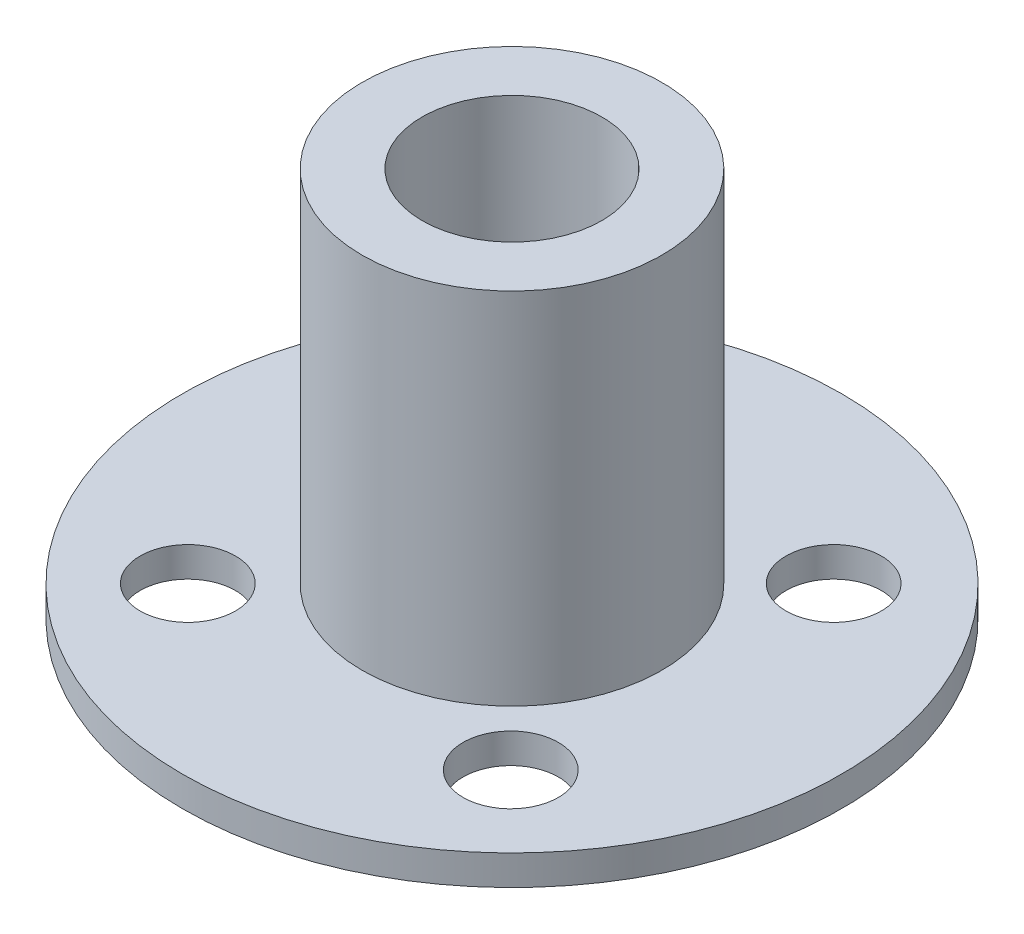
ISO-10303-21;
HEADER;
FILE_DESCRIPTION(('STEP AP214'),'2;1');
FILE_NAME('part.step','',(''),(''),'','','');
FILE_SCHEMA(('AUTOMOTIVE_DESIGN { 1 0 10303 214 1 1 1 1 }'));
ENDSEC;
DATA;
#1=APPLICATION_CONTEXT('core data for automotive mechanical design processes');
#2=APPLICATION_PROTOCOL_DEFINITION('international standard','automotive_design',2000,#1);
#3=PRODUCT_CONTEXT('',#1,'mechanical');
#4=PRODUCT('Part','Part','',(#3));
#5=PRODUCT_RELATED_PRODUCT_CATEGORY('part','',(#4));
#6=PRODUCT_DEFINITION_FORMATION('','',#4);
#7=PRODUCT_DEFINITION_CONTEXT('part definition',#1,'design');
#8=PRODUCT_DEFINITION('design','',#6,#7);
#9=PRODUCT_DEFINITION_SHAPE('','',#8);
#10=(LENGTH_UNIT() NAMED_UNIT(*) SI_UNIT(.MILLI.,.METRE.));
#11=(NAMED_UNIT(*) PLANE_ANGLE_UNIT() SI_UNIT($,.RADIAN.));
#12=(NAMED_UNIT(*) SI_UNIT($,.STERADIAN.) SOLID_ANGLE_UNIT());
#13=UNCERTAINTY_MEASURE_WITH_UNIT(LENGTH_MEASURE(1.E-05),#10,'distance_accuracy_value','');
#14=(GEOMETRIC_REPRESENTATION_CONTEXT(3) GLOBAL_UNCERTAINTY_ASSIGNED_CONTEXT((#13)) GLOBAL_UNIT_ASSIGNED_CONTEXT((#10,
#11,#12)) REPRESENTATION_CONTEXT('',''));
#15=CARTESIAN_POINT('',(0.,0.,0.));
#16=DIRECTION('',(0.,0.,1.));
#17=DIRECTION('',(1.,0.,0.));
#18=AXIS2_PLACEMENT_3D('',#15,#16,#17);
#19=CARTESIAN_POINT('',(0.,1.,0.));
#20=DIRECTION('',(0.,-1.,0.));
#21=DIRECTION('',(0.,0.,-1.));
#22=AXIS2_PLACEMENT_3D('',#19,#20,#21);
#23=CYLINDRICAL_SURFACE('',#22,11.);
#24=CARTESIAN_POINT('',(0.,1.,0.));
#25=DIRECTION('',(0.,1.,0.));
#26=DIRECTION('',(0.,0.,1.));
#27=AXIS2_PLACEMENT_3D('',#24,#25,#26);
#28=CIRCLE('',#27,11.);
#29=CARTESIAN_POINT('',(0.,1.,11.));
#30=VERTEX_POINT('',#29);
#31=EDGE_CURVE('E42',#30,#30,#28,.T.);
#32=ORIENTED_EDGE('',*,*,#31,.F.);
#33=EDGE_LOOP('',(#32));
#34=FACE_BOUND('',#33,.T.);
#35=CARTESIAN_POINT('',(0.,0.,0.));
#36=DIRECTION('',(0.,1.,0.));
#37=DIRECTION('',(0.,0.,1.));
#38=AXIS2_PLACEMENT_3D('',#35,#36,#37);
#39=CIRCLE('',#38,11.);
#40=CARTESIAN_POINT('',(0.,0.,11.));
#41=VERTEX_POINT('',#40);
#42=EDGE_CURVE('E38',#41,#41,#39,.T.);
#43=ORIENTED_EDGE('',*,*,#42,.T.);
#44=EDGE_LOOP('',(#43));
#45=FACE_BOUND('',#44,.T.);
#46=ADVANCED_FACE('F35',(#34,#45),#23,.T.);
#47=CARTESIAN_POINT('',(0.,1.,0.));
#48=DIRECTION('',(0.,1.,0.));
#49=DIRECTION('',(0.,0.,1.));
#50=AXIS2_PLACEMENT_3D('',#47,#48,#49);
#51=PLANE('',#50);
#52=CARTESIAN_POINT('',(5.35568955201766,1.,5.39783003838213));
#53=DIRECTION('',(0.,1.,0.));
#54=DIRECTION('',(0.,0.,1.));
#55=AXIS2_PLACEMENT_3D('',#52,#53,#54);
#56=CIRCLE('',#55,1.59115676356032);
#57=CARTESIAN_POINT('',(5.35568955201766,1.,6.98898680194246));
#58=VERTEX_POINT('',#57);
#59=EDGE_CURVE('E64',#58,#58,#56,.T.);
#60=ORIENTED_EDGE('',*,*,#59,.F.);
#61=EDGE_LOOP('',(#60));
#62=FACE_BOUND('',#61,.T.);
#63=CARTESIAN_POINT('',(-5.42311433016518,1.,5.39783003838213));
#64=DIRECTION('',(0.,1.,0.));
#65=DIRECTION('',(0.,0.,1.));
#66=AXIS2_PLACEMENT_3D('',#63,#64,#65);
#67=CIRCLE('',#66,1.59115676356032);
#68=CARTESIAN_POINT('',(-5.42311433016518,1.,6.98898680194245));
#69=VERTEX_POINT('',#68);
#70=EDGE_CURVE('E71',#69,#69,#67,.T.);
#71=ORIENTED_EDGE('',*,*,#70,.F.);
#72=EDGE_LOOP('',(#71));
#73=FACE_BOUND('',#72,.T.);
#74=CARTESIAN_POINT('',(-5.42311433018579,1.,-5.38097384381433));
#75=DIRECTION('',(0.,1.,0.));
#76=DIRECTION('',(0.,0.,1.));
#77=AXIS2_PLACEMENT_3D('',#74,#75,#76);
#78=CIRCLE('',#77,1.59115676358094);
#79=CARTESIAN_POINT('',(-5.42311433018579,1.,-3.78981708023339));
#80=VERTEX_POINT('',#79);
#81=EDGE_CURVE('E63',#80,#80,#78,.T.);
#82=ORIENTED_EDGE('',*,*,#81,.F.);
#83=EDGE_LOOP('',(#82));
#84=FACE_BOUND('',#83,.T.);
#85=CARTESIAN_POINT('',(5.35568955201766,1.,-5.3809738438007));
#86=DIRECTION('',(0.,1.,0.));
#87=DIRECTION('',(0.,0.,1.));
#88=AXIS2_PLACEMENT_3D('',#85,#86,#87);
#89=CIRCLE('',#88,1.59115676356033);
#90=CARTESIAN_POINT('',(5.35568955201766,1.,-3.78981708024038));
#91=VERTEX_POINT('',#90);
#92=EDGE_CURVE('E60',#91,#91,#89,.T.);
#93=ORIENTED_EDGE('',*,*,#92,.F.);
#94=EDGE_LOOP('',(#93));
#95=FACE_BOUND('',#94,.T.);
#96=CARTESIAN_POINT('',(0.,1.,0.));
#97=DIRECTION('',(0.,1.,0.));
#98=DIRECTION('',(0.,0.,1.));
#99=AXIS2_PLACEMENT_3D('',#96,#97,#98);
#100=CIRCLE('',#99,5.);
#101=CARTESIAN_POINT('',(0.,1.,5.));
#102=VERTEX_POINT('',#101);
#103=EDGE_CURVE('E10',#102,#102,#100,.T.);
#104=ORIENTED_EDGE('',*,*,#103,.F.);
#105=EDGE_LOOP('',(#104));
#106=FACE_BOUND('',#105,.T.);
#107=ORIENTED_EDGE('',*,*,#31,.T.);
#108=EDGE_LOOP('',(#107));
#109=FACE_BOUND('',#108,.T.);
#110=ADVANCED_FACE('F88',(#62,#73,#84,#95,#106,#109),#51,.T.);
#111=CARTESIAN_POINT('',(0.,0.,0.));
#112=DIRECTION('',(0.,1.,0.));
#113=DIRECTION('',(0.,0.,1.));
#114=AXIS2_PLACEMENT_3D('',#111,#112,#113);
#115=PLANE('',#114);
#116=CARTESIAN_POINT('',(5.35568955201766,0.,5.39783003838213));
#117=DIRECTION('',(0.,1.,0.));
#118=DIRECTION('',(0.,0.,1.));
#119=AXIS2_PLACEMENT_3D('',#116,#117,#118);
#120=CIRCLE('',#119,1.59115676356032);
#121=CARTESIAN_POINT('',(5.35568955201766,0.,6.98898680194246));
#122=VERTEX_POINT('',#121);
#123=EDGE_CURVE('E68',#122,#122,#120,.F.);
#124=ORIENTED_EDGE('',*,*,#123,.F.);
#125=EDGE_LOOP('',(#124));
#126=FACE_BOUND('',#125,.T.);
#127=CARTESIAN_POINT('',(-5.42311433016518,0.,5.39783003838213));
#128=DIRECTION('',(0.,1.,0.));
#129=DIRECTION('',(0.,0.,1.));
#130=AXIS2_PLACEMENT_3D('',#127,#128,#129);
#131=CIRCLE('',#130,1.59115676356032);
#132=CARTESIAN_POINT('',(-5.42311433016518,0.,6.98898680194245));
#133=VERTEX_POINT('',#132);
#134=EDGE_CURVE('E67',#133,#133,#131,.F.);
#135=ORIENTED_EDGE('',*,*,#134,.F.);
#136=EDGE_LOOP('',(#135));
#137=FACE_BOUND('',#136,.T.);
#138=CARTESIAN_POINT('',(-5.42311433018579,0.,-5.38097384381433));
#139=DIRECTION('',(0.,1.,0.));
#140=DIRECTION('',(0.,0.,1.));
#141=AXIS2_PLACEMENT_3D('',#138,#139,#140);
#142=CIRCLE('',#141,1.59115676358094);
#143=CARTESIAN_POINT('',(-5.42311433018579,0.,-3.78981708023339));
#144=VERTEX_POINT('',#143);
#145=EDGE_CURVE('E74',#144,#144,#142,.F.);
#146=ORIENTED_EDGE('',*,*,#145,.F.);
#147=EDGE_LOOP('',(#146));
#148=FACE_BOUND('',#147,.T.);
#149=CARTESIAN_POINT('',(5.35568955201766,0.,-5.3809738438007));
#150=DIRECTION('',(0.,1.,0.));
#151=DIRECTION('',(0.,0.,1.));
#152=AXIS2_PLACEMENT_3D('',#149,#150,#151);
#153=CIRCLE('',#152,1.59115676356033);
#154=CARTESIAN_POINT('',(5.35568955201766,0.,-3.78981708024038));
#155=VERTEX_POINT('',#154);
#156=EDGE_CURVE('E55',#155,#155,#153,.F.);
#157=ORIENTED_EDGE('',*,*,#156,.F.);
#158=EDGE_LOOP('',(#157));
#159=FACE_BOUND('',#158,.T.);
#160=ORIENTED_EDGE('',*,*,#42,.F.);
#161=EDGE_LOOP('',(#160));
#162=FACE_BOUND('',#161,.T.);
#163=ADVANCED_FACE('F84',(#126,#137,#148,#159,#162),#115,.F.);
#164=CARTESIAN_POINT('',(0.,13.,0.));
#165=DIRECTION('',(0.,-1.,0.));
#166=DIRECTION('',(0.,0.,-1.));
#167=AXIS2_PLACEMENT_3D('',#164,#165,#166);
#168=CYLINDRICAL_SURFACE('',#167,5.);
#169=CARTESIAN_POINT('',(0.,13.,0.));
#170=DIRECTION('',(0.,1.,0.));
#171=DIRECTION('',(0.,0.,1.));
#172=AXIS2_PLACEMENT_3D('',#169,#170,#171);
#173=CIRCLE('',#172,5.);
#174=CARTESIAN_POINT('',(0.,13.,5.));
#175=VERTEX_POINT('',#174);
#176=EDGE_CURVE('E48',#175,#175,#173,.T.);
#177=ORIENTED_EDGE('',*,*,#176,.F.);
#178=EDGE_LOOP('',(#177));
#179=FACE_BOUND('',#178,.T.);
#180=ORIENTED_EDGE('',*,*,#103,.T.);
#181=EDGE_LOOP('',(#180));
#182=FACE_BOUND('',#181,.T.);
#183=ADVANCED_FACE('F87',(#179,#182),#168,.T.);
#184=CARTESIAN_POINT('',(0.,13.,0.));
#185=DIRECTION('',(0.,1.,0.));
#186=DIRECTION('',(0.,0.,1.));
#187=AXIS2_PLACEMENT_3D('',#184,#185,#186);
#188=PLANE('',#187);
#189=CARTESIAN_POINT('',(0.,13.,0.));
#190=DIRECTION('',(0.,1.,0.));
#191=DIRECTION('',(0.,0.,1.));
#192=AXIS2_PLACEMENT_3D('',#189,#190,#191);
#193=CIRCLE('',#192,3.);
#194=CARTESIAN_POINT('',(0.,13.,3.));
#195=VERTEX_POINT('',#194);
#196=EDGE_CURVE('E52',#195,#195,#193,.T.);
#197=ORIENTED_EDGE('',*,*,#196,.F.);
#198=EDGE_LOOP('',(#197));
#199=FACE_BOUND('',#198,.T.);
#200=ORIENTED_EDGE('',*,*,#176,.T.);
#201=EDGE_LOOP('',(#200));
#202=FACE_BOUND('',#201,.T.);
#203=ADVANCED_FACE('F111',(#199,#202),#188,.T.);
#204=CARTESIAN_POINT('',(0.,1.,0.));
#205=DIRECTION('',(0.,1.,0.));
#206=DIRECTION('',(0.,0.,1.));
#207=AXIS2_PLACEMENT_3D('',#204,#205,#206);
#208=CYLINDRICAL_SURFACE('',#207,3.);
#209=CARTESIAN_POINT('',(0.,1.,0.));
#210=DIRECTION('',(0.,1.,0.));
#211=DIRECTION('',(0.,0.,1.));
#212=AXIS2_PLACEMENT_3D('',#209,#210,#211);
#213=CIRCLE('',#212,3.);
#214=CARTESIAN_POINT('',(0.,1.,3.));
#215=VERTEX_POINT('',#214);
#216=EDGE_CURVE('E51',#215,#215,#213,.T.);
#217=ORIENTED_EDGE('',*,*,#216,.F.);
#218=EDGE_LOOP('',(#217));
#219=FACE_BOUND('',#218,.T.);
#220=ORIENTED_EDGE('',*,*,#196,.T.);
#221=EDGE_LOOP('',(#220));
#222=FACE_BOUND('',#221,.T.);
#223=ADVANCED_FACE('F115',(#219,#222),#208,.F.);
#224=CARTESIAN_POINT('',(0.,1.,0.));
#225=DIRECTION('',(0.,1.,0.));
#226=DIRECTION('',(0.,0.,1.));
#227=AXIS2_PLACEMENT_3D('',#224,#225,#226);
#228=PLANE('',#227);
#229=ORIENTED_EDGE('',*,*,#216,.T.);
#230=EDGE_LOOP('',(#229));
#231=FACE_BOUND('',#230,.T.);
#232=ADVANCED_FACE('F119',(#231),#228,.T.);
#233=CARTESIAN_POINT('',(5.35568955201766,-0.000999999999999916,-5.3809738438007));
#234=DIRECTION('',(0.,1.,0.));
#235=DIRECTION('',(0.,0.,1.));
#236=AXIS2_PLACEMENT_3D('',#233,#234,#235);
#237=CYLINDRICAL_SURFACE('',#236,1.59115676356033);
#238=ORIENTED_EDGE('',*,*,#92,.T.);
#239=EDGE_LOOP('',(#238));
#240=FACE_BOUND('',#239,.T.);
#241=ORIENTED_EDGE('',*,*,#156,.T.);
#242=EDGE_LOOP('',(#241));
#243=FACE_BOUND('',#242,.T.);
#244=ADVANCED_FACE('F123',(#240,#243),#237,.F.);
#245=CARTESIAN_POINT('',(-5.42311433018579,-0.000999999999999916,-5.38097384381433));
#246=DIRECTION('',(0.,1.,0.));
#247=DIRECTION('',(0.,0.,1.));
#248=AXIS2_PLACEMENT_3D('',#245,#246,#247);
#249=CYLINDRICAL_SURFACE('',#248,1.59115676358094);
#250=ORIENTED_EDGE('',*,*,#81,.T.);
#251=EDGE_LOOP('',(#250));
#252=FACE_BOUND('',#251,.T.);
#253=ORIENTED_EDGE('',*,*,#145,.T.);
#254=EDGE_LOOP('',(#253));
#255=FACE_BOUND('',#254,.T.);
#256=ADVANCED_FACE('F82',(#252,#255),#249,.F.);
#257=CARTESIAN_POINT('',(-5.42311433016518,-0.000999999999999916,5.39783003838213));
#258=DIRECTION('',(0.,1.,0.));
#259=DIRECTION('',(0.,0.,1.));
#260=AXIS2_PLACEMENT_3D('',#257,#258,#259);
#261=CYLINDRICAL_SURFACE('',#260,1.59115676356032);
#262=ORIENTED_EDGE('',*,*,#70,.T.);
#263=EDGE_LOOP('',(#262));
#264=FACE_BOUND('',#263,.T.);
#265=ORIENTED_EDGE('',*,*,#134,.T.);
#266=EDGE_LOOP('',(#265));
#267=FACE_BOUND('',#266,.T.);
#268=ADVANCED_FACE('F131',(#264,#267),#261,.F.);
#269=CARTESIAN_POINT('',(5.35568955201766,-0.000999999999999916,5.39783003838213));
#270=DIRECTION('',(0.,1.,0.));
#271=DIRECTION('',(0.,0.,1.));
#272=AXIS2_PLACEMENT_3D('',#269,#270,#271);
#273=CYLINDRICAL_SURFACE('',#272,1.59115676356032);
#274=ORIENTED_EDGE('',*,*,#59,.T.);
#275=EDGE_LOOP('',(#274));
#276=FACE_BOUND('',#275,.T.);
#277=ORIENTED_EDGE('',*,*,#123,.T.);
#278=EDGE_LOOP('',(#277));
#279=FACE_BOUND('',#278,.T.);
#280=ADVANCED_FACE('F128',(#276,#279),#273,.F.);
#281=CLOSED_SHELL('',(#46,#110,#163,#183,#203,#223,#232,#244,#256,#268,#280));
#282=MANIFOLD_SOLID_BREP('B2',#281);
#283=ADVANCED_BREP_SHAPE_REPRESENTATION('',(#18,#282),#14);
#284=SHAPE_DEFINITION_REPRESENTATION(#9,#283);
ENDSEC;
END-ISO-10303-21;
